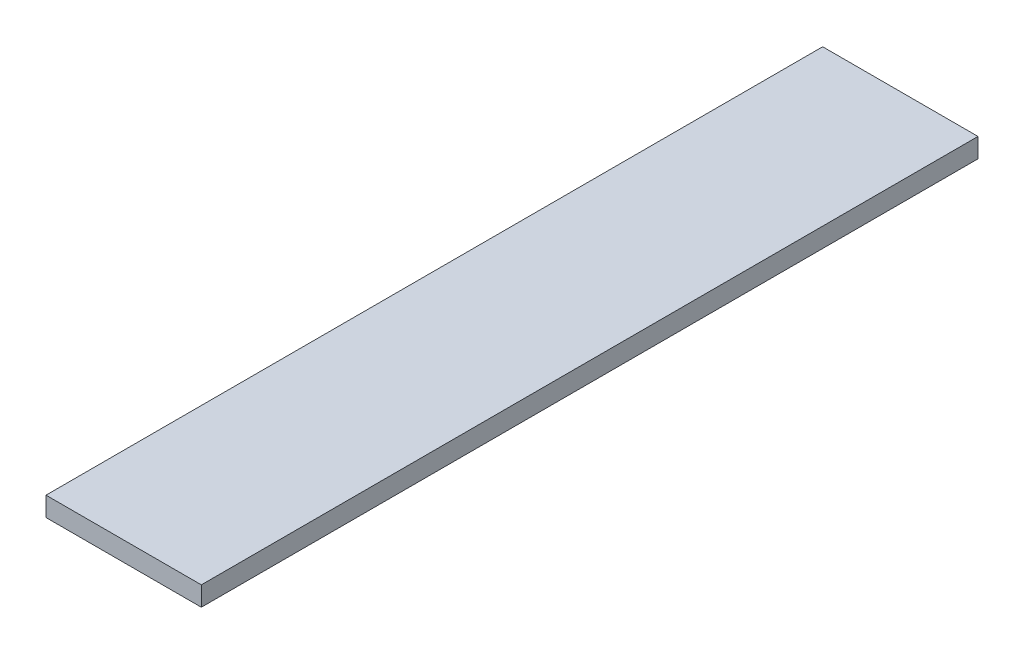
ISO-10303-21;
HEADER;
FILE_DESCRIPTION(('STEP AP214'),'2;1');
FILE_NAME('part.step','',(''),(''),'','','');
FILE_SCHEMA(('AUTOMOTIVE_DESIGN { 1 0 10303 214 1 1 1 1 }'));
ENDSEC;
DATA;
#1=APPLICATION_CONTEXT('core data for automotive mechanical design processes');
#2=APPLICATION_PROTOCOL_DEFINITION('international standard','automotive_design',2000,#1);
#3=PRODUCT_CONTEXT('',#1,'mechanical');
#4=PRODUCT('Part','Part','',(#3));
#5=PRODUCT_RELATED_PRODUCT_CATEGORY('part','',(#4));
#6=PRODUCT_DEFINITION_FORMATION('','',#4);
#7=PRODUCT_DEFINITION_CONTEXT('part definition',#1,'design');
#8=PRODUCT_DEFINITION('design','',#6,#7);
#9=PRODUCT_DEFINITION_SHAPE('','',#8);
#10=(LENGTH_UNIT() NAMED_UNIT(*) SI_UNIT(.MILLI.,.METRE.));
#11=(NAMED_UNIT(*) PLANE_ANGLE_UNIT() SI_UNIT($,.RADIAN.));
#12=(NAMED_UNIT(*) SI_UNIT($,.STERADIAN.) SOLID_ANGLE_UNIT());
#13=UNCERTAINTY_MEASURE_WITH_UNIT(LENGTH_MEASURE(1.E-05),#10,'distance_accuracy_value','');
#14=(GEOMETRIC_REPRESENTATION_CONTEXT(3) GLOBAL_UNCERTAINTY_ASSIGNED_CONTEXT((#13)) GLOBAL_UNIT_ASSIGNED_CONTEXT((#10,
#11,#12)) REPRESENTATION_CONTEXT('',''));
#15=CARTESIAN_POINT('',(0.,0.,0.));
#16=DIRECTION('',(0.,0.,1.));
#17=DIRECTION('',(1.,0.,0.));
#18=AXIS2_PLACEMENT_3D('',#15,#16,#17);
#19=CARTESIAN_POINT('',(0.,3.175,0.));
#20=DIRECTION('',(0.,0.,-1.));
#21=DIRECTION('',(-1.,0.,0.));
#22=AXIS2_PLACEMENT_3D('',#19,#20,#21);
#23=PLANE('',#22);
#24=DIRECTION('',(1.,0.,0.));
#25=VECTOR('',#24,1.);
#26=CARTESIAN_POINT('',(0.,0.,0.));
#27=LINE('',#26,#25);
#28=CARTESIAN_POINT('',(0.,0.,0.));
#29=VERTEX_POINT('',#28);
#30=CARTESIAN_POINT('',(25.4,0.,0.));
#31=VERTEX_POINT('',#30);
#32=EDGE_CURVE('E107',#29,#31,#27,.T.);
#33=ORIENTED_EDGE('',*,*,#32,.T.);
#34=DIRECTION('',(0.,-1.,0.));
#35=VECTOR('',#34,1.);
#36=CARTESIAN_POINT('',(25.4,3.175,0.));
#37=LINE('',#36,#35);
#38=CARTESIAN_POINT('',(25.4,3.175,0.));
#39=VERTEX_POINT('',#38);
#40=EDGE_CURVE('E11',#39,#31,#37,.T.);
#41=ORIENTED_EDGE('',*,*,#40,.F.);
#42=DIRECTION('',(1.,0.,0.));
#43=VECTOR('',#42,1.);
#44=CARTESIAN_POINT('',(0.,3.175,0.));
#45=LINE('',#44,#43);
#46=CARTESIAN_POINT('',(0.,3.175,0.));
#47=VERTEX_POINT('',#46);
#48=EDGE_CURVE('E89',#47,#39,#45,.T.);
#49=ORIENTED_EDGE('',*,*,#48,.F.);
#50=DIRECTION('',(0.,-1.,0.));
#51=VECTOR('',#50,1.);
#52=CARTESIAN_POINT('',(0.,3.175,0.));
#53=LINE('',#52,#51);
#54=EDGE_CURVE('E56',#47,#29,#53,.T.);
#55=ORIENTED_EDGE('',*,*,#54,.T.);
#56=EDGE_LOOP('',(#33,#41,#49,#55));
#57=FACE_BOUND('',#56,.T.);
#58=ADVANCED_FACE('F39',(#57),#23,.F.);
#59=CARTESIAN_POINT('',(25.4,3.175,0.));
#60=DIRECTION('',(-1.,0.,0.));
#61=DIRECTION('',(0.,0.,1.));
#62=AXIS2_PLACEMENT_3D('',#59,#60,#61);
#63=PLANE('',#62);
#64=DIRECTION('',(0.,0.,-1.));
#65=VECTOR('',#64,1.);
#66=CARTESIAN_POINT('',(25.4,0.,0.));
#67=LINE('',#66,#65);
#68=CARTESIAN_POINT('',(25.4,0.,-127.));
#69=VERTEX_POINT('',#68);
#70=EDGE_CURVE('E95',#31,#69,#67,.T.);
#71=ORIENTED_EDGE('',*,*,#70,.T.);
#72=DIRECTION('',(0.,-1.,0.));
#73=VECTOR('',#72,1.);
#74=CARTESIAN_POINT('',(25.4,3.175,-127.));
#75=LINE('',#74,#73);
#76=CARTESIAN_POINT('',(25.4,3.175,-127.));
#77=VERTEX_POINT('',#76);
#78=EDGE_CURVE('E48',#77,#69,#75,.T.);
#79=ORIENTED_EDGE('',*,*,#78,.F.);
#80=DIRECTION('',(0.,0.,-1.));
#81=VECTOR('',#80,1.);
#82=CARTESIAN_POINT('',(25.4,3.175,0.));
#83=LINE('',#82,#81);
#84=EDGE_CURVE('E81',#39,#77,#83,.T.);
#85=ORIENTED_EDGE('',*,*,#84,.F.);
#86=ORIENTED_EDGE('',*,*,#40,.T.);
#87=EDGE_LOOP('',(#71,#79,#85,#86));
#88=FACE_BOUND('',#87,.T.);
#89=ADVANCED_FACE('F94',(#88),#63,.F.);
#90=CARTESIAN_POINT('',(0.,3.175,-127.));
#91=DIRECTION('',(0.,0.,-1.));
#92=DIRECTION('',(-1.,0.,0.));
#93=AXIS2_PLACEMENT_3D('',#90,#91,#92);
#94=PLANE('',#93);
#95=DIRECTION('',(1.,0.,0.));
#96=VECTOR('',#95,1.);
#97=CARTESIAN_POINT('',(0.,0.,-127.));
#98=LINE('',#97,#96);
#99=CARTESIAN_POINT('',(0.,0.,-127.));
#100=VERTEX_POINT('',#99);
#101=EDGE_CURVE('E112',#100,#69,#98,.T.);
#102=ORIENTED_EDGE('',*,*,#101,.F.);
#103=DIRECTION('',(0.,-1.,0.));
#104=VECTOR('',#103,1.);
#105=CARTESIAN_POINT('',(0.,3.175,-127.));
#106=LINE('',#105,#104);
#107=CARTESIAN_POINT('',(0.,3.175,-127.));
#108=VERTEX_POINT('',#107);
#109=EDGE_CURVE('E70',#108,#100,#106,.T.);
#110=ORIENTED_EDGE('',*,*,#109,.F.);
#111=DIRECTION('',(1.,0.,0.));
#112=VECTOR('',#111,1.);
#113=CARTESIAN_POINT('',(0.,3.175,-127.));
#114=LINE('',#113,#112);
#115=EDGE_CURVE('E88',#108,#77,#114,.T.);
#116=ORIENTED_EDGE('',*,*,#115,.T.);
#117=ORIENTED_EDGE('',*,*,#78,.T.);
#118=EDGE_LOOP('',(#102,#110,#116,#117));
#119=FACE_BOUND('',#118,.T.);
#120=ADVANCED_FACE('F99',(#119),#94,.T.);
#121=CARTESIAN_POINT('',(0.,3.175,0.));
#122=DIRECTION('',(-1.,0.,0.));
#123=DIRECTION('',(0.,0.,1.));
#124=AXIS2_PLACEMENT_3D('',#121,#122,#123);
#125=PLANE('',#124);
#126=DIRECTION('',(0.,0.,-1.));
#127=VECTOR('',#126,1.);
#128=CARTESIAN_POINT('',(0.,0.,0.));
#129=LINE('',#128,#127);
#130=EDGE_CURVE('E115',#29,#100,#129,.T.);
#131=ORIENTED_EDGE('',*,*,#130,.F.);
#132=ORIENTED_EDGE('',*,*,#54,.F.);
#133=DIRECTION('',(0.,0.,-1.));
#134=VECTOR('',#133,1.);
#135=CARTESIAN_POINT('',(0.,3.175,0.));
#136=LINE('',#135,#134);
#137=EDGE_CURVE('E101',#47,#108,#136,.T.);
#138=ORIENTED_EDGE('',*,*,#137,.T.);
#139=ORIENTED_EDGE('',*,*,#109,.T.);
#140=EDGE_LOOP('',(#131,#132,#138,#139));
#141=FACE_BOUND('',#140,.T.);
#142=ADVANCED_FACE('F125',(#141),#125,.T.);
#143=CARTESIAN_POINT('',(0.,3.175,0.));
#144=DIRECTION('',(0.,1.,0.));
#145=DIRECTION('',(0.,0.,1.));
#146=AXIS2_PLACEMENT_3D('',#143,#144,#145);
#147=PLANE('',#146);
#148=ORIENTED_EDGE('',*,*,#48,.T.);
#149=ORIENTED_EDGE('',*,*,#84,.T.);
#150=ORIENTED_EDGE('',*,*,#115,.F.);
#151=ORIENTED_EDGE('',*,*,#137,.F.);
#152=EDGE_LOOP('',(#148,#149,#150,#151));
#153=FACE_BOUND('',#152,.T.);
#154=ADVANCED_FACE('F85',(#153),#147,.T.);
#155=CARTESIAN_POINT('',(0.,0.,0.));
#156=DIRECTION('',(0.,1.,0.));
#157=DIRECTION('',(0.,0.,1.));
#158=AXIS2_PLACEMENT_3D('',#155,#156,#157);
#159=PLANE('',#158);
#160=ORIENTED_EDGE('',*,*,#32,.F.);
#161=ORIENTED_EDGE('',*,*,#130,.T.);
#162=ORIENTED_EDGE('',*,*,#101,.T.);
#163=ORIENTED_EDGE('',*,*,#70,.F.);
#164=EDGE_LOOP('',(#160,#161,#162,#163));
#165=FACE_BOUND('',#164,.T.);
#166=ADVANCED_FACE('F124',(#165),#159,.F.);
#167=CLOSED_SHELL('',(#58,#89,#120,#142,#154,#166));
#168=MANIFOLD_SOLID_BREP('B2',#167);
#169=ADVANCED_BREP_SHAPE_REPRESENTATION('',(#18,#168),#14);
#170=SHAPE_DEFINITION_REPRESENTATION(#9,#169);
ENDSEC;
END-ISO-10303-21;
